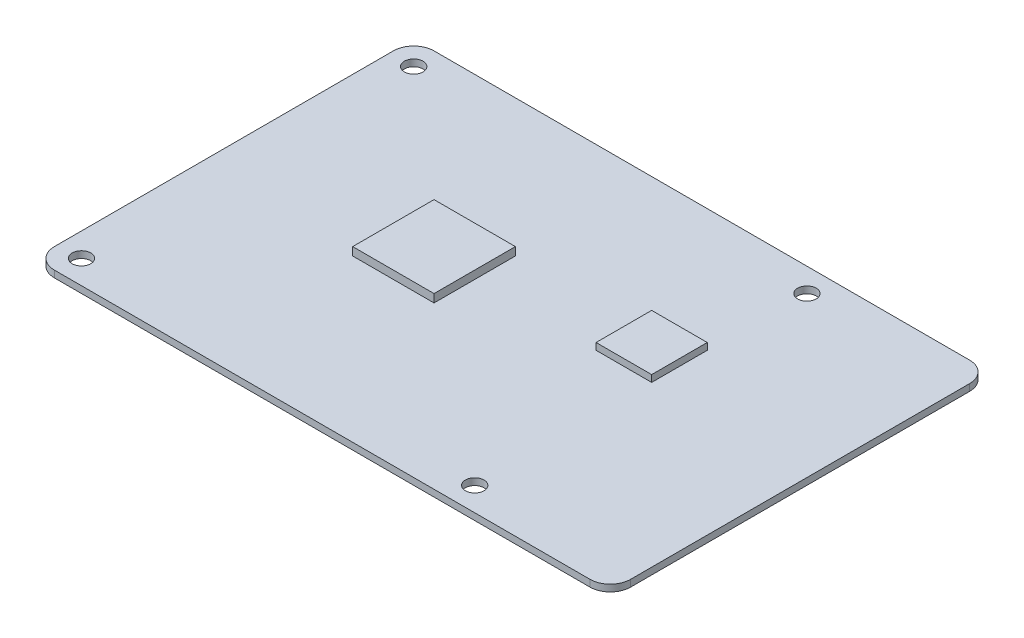
ISO-10303-21;
HEADER;
FILE_DESCRIPTION(('STEP AP214'),'2;1');
FILE_NAME('part.step','',(''),(''),'','','');
FILE_SCHEMA(('AUTOMOTIVE_DESIGN { 1 0 10303 214 1 1 1 1 }'));
ENDSEC;
DATA;
#1=APPLICATION_CONTEXT('core data for automotive mechanical design processes');
#2=APPLICATION_PROTOCOL_DEFINITION('international standard','automotive_design',2000,#1);
#3=PRODUCT_CONTEXT('',#1,'mechanical');
#4=PRODUCT('Part','Part','',(#3));
#5=PRODUCT_RELATED_PRODUCT_CATEGORY('part','',(#4));
#6=PRODUCT_DEFINITION_FORMATION('','',#4);
#7=PRODUCT_DEFINITION_CONTEXT('part definition',#1,'design');
#8=PRODUCT_DEFINITION('design','',#6,#7);
#9=PRODUCT_DEFINITION_SHAPE('','',#8);
#10=(LENGTH_UNIT() NAMED_UNIT(*) SI_UNIT(.MILLI.,.METRE.));
#11=(NAMED_UNIT(*) PLANE_ANGLE_UNIT() SI_UNIT($,.RADIAN.));
#12=(NAMED_UNIT(*) SI_UNIT($,.STERADIAN.) SOLID_ANGLE_UNIT());
#13=UNCERTAINTY_MEASURE_WITH_UNIT(LENGTH_MEASURE(1.E-05),#10,'distance_accuracy_value','');
#14=(GEOMETRIC_REPRESENTATION_CONTEXT(3) GLOBAL_UNCERTAINTY_ASSIGNED_CONTEXT((#13)) GLOBAL_UNIT_ASSIGNED_CONTEXT((#10,
#11,#12)) REPRESENTATION_CONTEXT('',''));
#15=CARTESIAN_POINT('',(0.,0.,0.));
#16=DIRECTION('',(0.,0.,1.));
#17=DIRECTION('',(1.,0.,0.));
#18=AXIS2_PLACEMENT_3D('',#15,#16,#17);
#19=CARTESIAN_POINT('',(0.,1.,0.));
#20=DIRECTION('',(0.,1.,0.));
#21=DIRECTION('',(0.,0.,1.));
#22=AXIS2_PLACEMENT_3D('',#19,#20,#21);
#23=PLANE('',#22);
#24=DIRECTION('',(-1.,0.,0.));
#25=VECTOR('',#24,1.);
#26=CARTESIAN_POINT('',(-19.3,1.,-7.79999999999998));
#27=LINE('',#26,#25);
#28=CARTESIAN_POINT('',(-7.29999999999999,1.,-7.79999999999998));
#29=VERTEX_POINT('',#28);
#30=CARTESIAN_POINT('',(-19.3,1.,-7.79999999999998));
#31=VERTEX_POINT('',#30);
#32=EDGE_CURVE('E177',#29,#31,#27,.T.);
#33=ORIENTED_EDGE('',*,*,#32,.F.);
#34=DIRECTION('',(0.,0.,-1.));
#35=VECTOR('',#34,1.);
#36=CARTESIAN_POINT('',(-7.29999999999999,1.,-7.79999999999998));
#37=LINE('',#36,#35);
#38=CARTESIAN_POINT('',(-7.29999999999999,1.,4.20000000000002));
#39=VERTEX_POINT('',#38);
#40=EDGE_CURVE('E174',#39,#29,#37,.T.);
#41=ORIENTED_EDGE('',*,*,#40,.F.);
#42=DIRECTION('',(1.,0.,0.));
#43=VECTOR('',#42,1.);
#44=CARTESIAN_POINT('',(-19.3,1.,4.20000000000002));
#45=LINE('',#44,#43);
#46=CARTESIAN_POINT('',(-19.3,1.,4.20000000000002));
#47=VERTEX_POINT('',#46);
#48=EDGE_CURVE('E186',#47,#39,#45,.T.);
#49=ORIENTED_EDGE('',*,*,#48,.F.);
#50=DIRECTION('',(0.,0.,1.));
#51=VECTOR('',#50,1.);
#52=CARTESIAN_POINT('',(-19.3,1.,-7.79999999999998));
#53=LINE('',#52,#51);
#54=EDGE_CURVE('E194',#31,#47,#53,.T.);
#55=ORIENTED_EDGE('',*,*,#54,.F.);
#56=EDGE_LOOP('',(#33,#41,#49,#55));
#57=FACE_BOUND('',#56,.T.);
#58=CARTESIAN_POINT('',(19.,1.,24.5));
#59=DIRECTION('',(0.,1.,0.));
#60=DIRECTION('',(0.,0.,1.));
#61=AXIS2_PLACEMENT_3D('',#58,#59,#60);
#62=CIRCLE('',#61,1.375);
#63=CARTESIAN_POINT('',(19.,1.,25.875));
#64=VERTEX_POINT('',#63);
#65=EDGE_CURVE('E205',#64,#64,#62,.T.);
#66=ORIENTED_EDGE('',*,*,#65,.F.);
#67=EDGE_LOOP('',(#66));
#68=FACE_BOUND('',#67,.T.);
#69=CARTESIAN_POINT('',(-39.,1.,24.5));
#70=DIRECTION('',(0.,1.,0.));
#71=DIRECTION('',(0.,0.,1.));
#72=AXIS2_PLACEMENT_3D('',#69,#70,#71);
#73=CIRCLE('',#72,1.375);
#74=CARTESIAN_POINT('',(-39.,1.,25.875));
#75=VERTEX_POINT('',#74);
#76=EDGE_CURVE('E209',#75,#75,#73,.T.);
#77=ORIENTED_EDGE('',*,*,#76,.F.);
#78=EDGE_LOOP('',(#77));
#79=FACE_BOUND('',#78,.T.);
#80=CARTESIAN_POINT('',(-39.,1.,-24.5));
#81=DIRECTION('',(0.,1.,0.));
#82=DIRECTION('',(0.,0.,1.));
#83=AXIS2_PLACEMENT_3D('',#80,#81,#82);
#84=CIRCLE('',#83,1.375);
#85=CARTESIAN_POINT('',(-39.,1.,-23.125));
#86=VERTEX_POINT('',#85);
#87=EDGE_CURVE('E215',#86,#86,#84,.T.);
#88=ORIENTED_EDGE('',*,*,#87,.F.);
#89=EDGE_LOOP('',(#88));
#90=FACE_BOUND('',#89,.T.);
#91=CARTESIAN_POINT('',(19.,1.,-24.5));
#92=DIRECTION('',(0.,1.,0.));
#93=DIRECTION('',(0.,0.,1.));
#94=AXIS2_PLACEMENT_3D('',#91,#92,#93);
#95=CIRCLE('',#94,1.375);
#96=CARTESIAN_POINT('',(19.,1.,-23.125));
#97=VERTEX_POINT('',#96);
#98=EDGE_CURVE('E221',#97,#97,#95,.T.);
#99=ORIENTED_EDGE('',*,*,#98,.F.);
#100=EDGE_LOOP('',(#99));
#101=FACE_BOUND('',#100,.T.);
#102=DIRECTION('',(-1.,0.,0.));
#103=VECTOR('',#102,1.);
#104=CARTESIAN_POINT('',(42.5,1.,-28.));
#105=LINE('',#104,#103);
#106=CARTESIAN_POINT('',(39.5,1.,-28.));
#107=VERTEX_POINT('',#106);
#108=CARTESIAN_POINT('',(-39.5,1.,-28.));
#109=VERTEX_POINT('',#108);
#110=EDGE_CURVE('E240',#107,#109,#105,.T.);
#111=ORIENTED_EDGE('',*,*,#110,.T.);
#112=CARTESIAN_POINT('',(-39.5,1.,-25.));
#113=DIRECTION('',(0.,1.,0.));
#114=DIRECTION('',(0.,0.,1.));
#115=AXIS2_PLACEMENT_3D('',#112,#113,#114);
#116=CIRCLE('',#115,3.);
#117=CARTESIAN_POINT('',(-42.5,1.,-25.));
#118=VERTEX_POINT('',#117);
#119=EDGE_CURVE('E277',#109,#118,#116,.T.);
#120=ORIENTED_EDGE('',*,*,#119,.T.);
#121=DIRECTION('',(0.,0.,1.));
#122=VECTOR('',#121,1.);
#123=CARTESIAN_POINT('',(-42.5,1.,28.));
#124=LINE('',#123,#122);
#125=CARTESIAN_POINT('',(-42.5,1.,25.));
#126=VERTEX_POINT('',#125);
#127=EDGE_CURVE('E230',#118,#126,#124,.T.);
#128=ORIENTED_EDGE('',*,*,#127,.T.);
#129=CARTESIAN_POINT('',(-39.5,1.,25.));
#130=DIRECTION('',(0.,1.,0.));
#131=DIRECTION('',(0.,0.,1.));
#132=AXIS2_PLACEMENT_3D('',#129,#130,#131);
#133=CIRCLE('',#132,3.);
#134=CARTESIAN_POINT('',(-39.5,1.,28.));
#135=VERTEX_POINT('',#134);
#136=EDGE_CURVE('E271',#126,#135,#133,.T.);
#137=ORIENTED_EDGE('',*,*,#136,.T.);
#138=DIRECTION('',(1.,0.,0.));
#139=VECTOR('',#138,1.);
#140=CARTESIAN_POINT('',(42.5,1.,28.));
#141=LINE('',#140,#139);
#142=CARTESIAN_POINT('',(39.5,1.,28.));
#143=VERTEX_POINT('',#142);
#144=EDGE_CURVE('E233',#135,#143,#141,.T.);
#145=ORIENTED_EDGE('',*,*,#144,.T.);
#146=CARTESIAN_POINT('',(39.5,1.,25.));
#147=DIRECTION('',(0.,1.,0.));
#148=DIRECTION('',(0.,0.,1.));
#149=AXIS2_PLACEMENT_3D('',#146,#147,#148);
#150=CIRCLE('',#149,3.);
#151=CARTESIAN_POINT('',(42.5,1.,25.));
#152=VERTEX_POINT('',#151);
#153=EDGE_CURVE('E273',#143,#152,#150,.T.);
#154=ORIENTED_EDGE('',*,*,#153,.T.);
#155=DIRECTION('',(0.,0.,-1.));
#156=VECTOR('',#155,1.);
#157=CARTESIAN_POINT('',(42.5,1.,28.));
#158=LINE('',#157,#156);
#159=CARTESIAN_POINT('',(42.5,1.,-25.));
#160=VERTEX_POINT('',#159);
#161=EDGE_CURVE('E237',#152,#160,#158,.T.);
#162=ORIENTED_EDGE('',*,*,#161,.T.);
#163=CARTESIAN_POINT('',(39.5,1.,-25.));
#164=DIRECTION('',(0.,1.,0.));
#165=DIRECTION('',(0.,0.,1.));
#166=AXIS2_PLACEMENT_3D('',#163,#164,#165);
#167=CIRCLE('',#166,3.);
#168=EDGE_CURVE('E275',#160,#107,#167,.T.);
#169=ORIENTED_EDGE('',*,*,#168,.T.);
#170=EDGE_LOOP('',(#111,#120,#128,#137,#145,#154,#162,#169));
#171=FACE_BOUND('',#170,.T.);
#172=DIRECTION('',(-1.,0.,0.));
#173=VECTOR('',#172,1.);
#174=CARTESIAN_POINT('',(10.7,1.,-9.9));
#175=LINE('',#174,#173);
#176=CARTESIAN_POINT('',(18.9,1.,-9.9));
#177=VERTEX_POINT('',#176);
#178=CARTESIAN_POINT('',(10.7,1.,-9.9));
#179=VERTEX_POINT('',#178);
#180=EDGE_CURVE('E517',#177,#179,#175,.T.);
#181=ORIENTED_EDGE('',*,*,#180,.F.);
#182=DIRECTION('',(0.,0.,-1.));
#183=VECTOR('',#182,1.);
#184=CARTESIAN_POINT('',(18.9,1.,-9.9));
#185=LINE('',#184,#183);
#186=CARTESIAN_POINT('',(18.9,1.,-1.7));
#187=VERTEX_POINT('',#186);
#188=EDGE_CURVE('E172',#187,#177,#185,.T.);
#189=ORIENTED_EDGE('',*,*,#188,.F.);
#190=DIRECTION('',(1.,0.,0.));
#191=VECTOR('',#190,1.);
#192=CARTESIAN_POINT('',(10.7,1.,-1.7));
#193=LINE('',#192,#191);
#194=CARTESIAN_POINT('',(10.7,1.,-1.7));
#195=VERTEX_POINT('',#194);
#196=EDGE_CURVE('E168',#195,#187,#193,.T.);
#197=ORIENTED_EDGE('',*,*,#196,.F.);
#198=DIRECTION('',(0.,0.,1.));
#199=VECTOR('',#198,1.);
#200=CARTESIAN_POINT('',(10.7,1.,-9.9));
#201=LINE('',#200,#199);
#202=EDGE_CURVE('E514',#179,#195,#201,.T.);
#203=ORIENTED_EDGE('',*,*,#202,.F.);
#204=EDGE_LOOP('',(#181,#189,#197,#203));
#205=FACE_BOUND('',#204,.T.);
#206=ADVANCED_FACE('F36',(#57,#68,#79,#90,#101,#171,#205),#23,.T.);
#207=CARTESIAN_POINT('',(-42.5,1.,28.));
#208=DIRECTION('',(1.,0.,0.));
#209=DIRECTION('',(0.,0.,-1.));
#210=AXIS2_PLACEMENT_3D('',#207,#208,#209);
#211=PLANE('',#210);
#212=ORIENTED_EDGE('',*,*,#127,.F.);
#213=DIRECTION('',(0.,-1.,0.));
#214=VECTOR('',#213,1.);
#215=CARTESIAN_POINT('',(-42.5,1.,-25.));
#216=LINE('',#215,#214);
#217=CARTESIAN_POINT('',(-42.5,0.,-25.));
#218=VERTEX_POINT('',#217);
#219=EDGE_CURVE('E255',#118,#218,#216,.T.);
#220=ORIENTED_EDGE('',*,*,#219,.T.);
#221=DIRECTION('',(0.,0.,1.));
#222=VECTOR('',#221,1.);
#223=CARTESIAN_POINT('',(-42.5,0.,28.));
#224=LINE('',#223,#222);
#225=CARTESIAN_POINT('',(-42.5,0.,25.));
#226=VERTEX_POINT('',#225);
#227=EDGE_CURVE('E227',#218,#226,#224,.T.);
#228=ORIENTED_EDGE('',*,*,#227,.T.);
#229=DIRECTION('',(0.,-1.,0.));
#230=VECTOR('',#229,1.);
#231=CARTESIAN_POINT('',(-42.5,1.,25.));
#232=LINE('',#231,#230);
#233=EDGE_CURVE('E243',#226,#126,#232,.F.);
#234=ORIENTED_EDGE('',*,*,#233,.T.);
#235=EDGE_LOOP('',(#212,#220,#228,#234));
#236=FACE_BOUND('',#235,.T.);
#237=ADVANCED_FACE('F321',(#236),#211,.F.);
#238=CARTESIAN_POINT('',(42.5,1.,28.));
#239=DIRECTION('',(0.,0.,-1.));
#240=DIRECTION('',(-1.,0.,0.));
#241=AXIS2_PLACEMENT_3D('',#238,#239,#240);
#242=PLANE('',#241);
#243=DIRECTION('',(1.,0.,0.));
#244=VECTOR('',#243,1.);
#245=CARTESIAN_POINT('',(42.5,0.,28.));
#246=LINE('',#245,#244);
#247=CARTESIAN_POINT('',(-39.5,0.,28.));
#248=VERTEX_POINT('',#247);
#249=CARTESIAN_POINT('',(39.5,0.,28.));
#250=VERTEX_POINT('',#249);
#251=EDGE_CURVE('E246',#248,#250,#246,.T.);
#252=ORIENTED_EDGE('',*,*,#251,.T.);
#253=DIRECTION('',(0.,-1.,0.));
#254=VECTOR('',#253,1.);
#255=CARTESIAN_POINT('',(39.5,1.,28.));
#256=LINE('',#255,#254);
#257=EDGE_CURVE('E11',#250,#143,#256,.F.);
#258=ORIENTED_EDGE('',*,*,#257,.T.);
#259=ORIENTED_EDGE('',*,*,#144,.F.);
#260=DIRECTION('',(0.,-1.,0.));
#261=VECTOR('',#260,1.);
#262=CARTESIAN_POINT('',(-39.5,1.,28.));
#263=LINE('',#262,#261);
#264=EDGE_CURVE('E44',#135,#248,#263,.T.);
#265=ORIENTED_EDGE('',*,*,#264,.T.);
#266=EDGE_LOOP('',(#252,#258,#259,#265));
#267=FACE_BOUND('',#266,.T.);
#268=ADVANCED_FACE('F288',(#267),#242,.F.);
#269=CARTESIAN_POINT('',(42.5,1.,28.));
#270=DIRECTION('',(-1.,0.,0.));
#271=DIRECTION('',(0.,0.,1.));
#272=AXIS2_PLACEMENT_3D('',#269,#270,#271);
#273=PLANE('',#272);
#274=DIRECTION('',(0.,0.,-1.));
#275=VECTOR('',#274,1.);
#276=CARTESIAN_POINT('',(42.5,0.,28.));
#277=LINE('',#276,#275);
#278=CARTESIAN_POINT('',(42.5,0.,25.));
#279=VERTEX_POINT('',#278);
#280=CARTESIAN_POINT('',(42.5,0.,-25.));
#281=VERTEX_POINT('',#280);
#282=EDGE_CURVE('E249',#279,#281,#277,.T.);
#283=ORIENTED_EDGE('',*,*,#282,.T.);
#284=DIRECTION('',(0.,-1.,0.));
#285=VECTOR('',#284,1.);
#286=CARTESIAN_POINT('',(42.5,1.,-25.));
#287=LINE('',#286,#285);
#288=EDGE_CURVE('E282',#281,#160,#287,.F.);
#289=ORIENTED_EDGE('',*,*,#288,.T.);
#290=ORIENTED_EDGE('',*,*,#161,.F.);
#291=DIRECTION('',(0.,-1.,0.));
#292=VECTOR('',#291,1.);
#293=CARTESIAN_POINT('',(42.5,1.,25.));
#294=LINE('',#293,#292);
#295=EDGE_CURVE('E279',#152,#279,#294,.T.);
#296=ORIENTED_EDGE('',*,*,#295,.T.);
#297=EDGE_LOOP('',(#283,#289,#290,#296));
#298=FACE_BOUND('',#297,.T.);
#299=ADVANCED_FACE('F302',(#298),#273,.F.);
#300=CARTESIAN_POINT('',(42.5,1.,-28.));
#301=DIRECTION('',(0.,0.,1.));
#302=DIRECTION('',(1.,0.,0.));
#303=AXIS2_PLACEMENT_3D('',#300,#301,#302);
#304=PLANE('',#303);
#305=DIRECTION('',(-1.,0.,0.));
#306=VECTOR('',#305,1.);
#307=CARTESIAN_POINT('',(42.5,0.,-28.));
#308=LINE('',#307,#306);
#309=CARTESIAN_POINT('',(39.5,0.,-28.));
#310=VERTEX_POINT('',#309);
#311=CARTESIAN_POINT('',(-39.5,0.,-28.));
#312=VERTEX_POINT('',#311);
#313=EDGE_CURVE('E234',#310,#312,#308,.T.);
#314=ORIENTED_EDGE('',*,*,#313,.T.);
#315=DIRECTION('',(0.,-1.,0.));
#316=VECTOR('',#315,1.);
#317=CARTESIAN_POINT('',(-39.5,1.,-28.));
#318=LINE('',#317,#316);
#319=EDGE_CURVE('E269',#312,#109,#318,.F.);
#320=ORIENTED_EDGE('',*,*,#319,.T.);
#321=ORIENTED_EDGE('',*,*,#110,.F.);
#322=DIRECTION('',(0.,-1.,0.));
#323=VECTOR('',#322,1.);
#324=CARTESIAN_POINT('',(39.5,1.,-28.));
#325=LINE('',#324,#323);
#326=EDGE_CURVE('E266',#107,#310,#325,.T.);
#327=ORIENTED_EDGE('',*,*,#326,.T.);
#328=EDGE_LOOP('',(#314,#320,#321,#327));
#329=FACE_BOUND('',#328,.T.);
#330=ADVANCED_FACE('F313',(#329),#304,.F.);
#331=CARTESIAN_POINT('',(0.,0.,0.));
#332=DIRECTION('',(0.,1.,0.));
#333=DIRECTION('',(0.,0.,1.));
#334=AXIS2_PLACEMENT_3D('',#331,#332,#333);
#335=PLANE('',#334);
#336=CARTESIAN_POINT('',(19.,0.,24.5));
#337=DIRECTION('',(0.,1.,0.));
#338=DIRECTION('',(0.,0.,1.));
#339=AXIS2_PLACEMENT_3D('',#336,#337,#338);
#340=CIRCLE('',#339,1.375);
#341=CARTESIAN_POINT('',(19.,0.,25.875));
#342=VERTEX_POINT('',#341);
#343=EDGE_CURVE('E206',#342,#342,#340,.T.);
#344=ORIENTED_EDGE('',*,*,#343,.T.);
#345=EDGE_LOOP('',(#344));
#346=FACE_BOUND('',#345,.T.);
#347=CARTESIAN_POINT('',(-39.,0.,24.5));
#348=DIRECTION('',(0.,1.,0.));
#349=DIRECTION('',(0.,0.,1.));
#350=AXIS2_PLACEMENT_3D('',#347,#348,#349);
#351=CIRCLE('',#350,1.375);
#352=CARTESIAN_POINT('',(-39.,0.,25.875));
#353=VERTEX_POINT('',#352);
#354=EDGE_CURVE('E212',#353,#353,#351,.T.);
#355=ORIENTED_EDGE('',*,*,#354,.T.);
#356=EDGE_LOOP('',(#355));
#357=FACE_BOUND('',#356,.T.);
#358=CARTESIAN_POINT('',(-39.,0.,-24.5));
#359=DIRECTION('',(0.,1.,0.));
#360=DIRECTION('',(0.,0.,1.));
#361=AXIS2_PLACEMENT_3D('',#358,#359,#360);
#362=CIRCLE('',#361,1.375);
#363=CARTESIAN_POINT('',(-39.,0.,-23.125));
#364=VERTEX_POINT('',#363);
#365=EDGE_CURVE('E218',#364,#364,#362,.T.);
#366=ORIENTED_EDGE('',*,*,#365,.T.);
#367=EDGE_LOOP('',(#366));
#368=FACE_BOUND('',#367,.T.);
#369=CARTESIAN_POINT('',(19.,0.,-24.5));
#370=DIRECTION('',(0.,1.,0.));
#371=DIRECTION('',(0.,0.,1.));
#372=AXIS2_PLACEMENT_3D('',#369,#370,#371);
#373=CIRCLE('',#372,1.375);
#374=CARTESIAN_POINT('',(19.,0.,-23.125));
#375=VERTEX_POINT('',#374);
#376=EDGE_CURVE('E224',#375,#375,#373,.T.);
#377=ORIENTED_EDGE('',*,*,#376,.T.);
#378=EDGE_LOOP('',(#377));
#379=FACE_BOUND('',#378,.T.);
#380=ORIENTED_EDGE('',*,*,#227,.F.);
#381=CARTESIAN_POINT('',(-39.5,0.,-25.));
#382=DIRECTION('',(0.,1.,0.));
#383=DIRECTION('',(0.,0.,1.));
#384=AXIS2_PLACEMENT_3D('',#381,#382,#383);
#385=CIRCLE('',#384,3.);
#386=EDGE_CURVE('E264',#218,#312,#385,.F.);
#387=ORIENTED_EDGE('',*,*,#386,.T.);
#388=ORIENTED_EDGE('',*,*,#313,.F.);
#389=CARTESIAN_POINT('',(39.5,0.,-25.));
#390=DIRECTION('',(0.,1.,0.));
#391=DIRECTION('',(0.,0.,1.));
#392=AXIS2_PLACEMENT_3D('',#389,#390,#391);
#393=CIRCLE('',#392,3.);
#394=EDGE_CURVE('E262',#310,#281,#393,.F.);
#395=ORIENTED_EDGE('',*,*,#394,.T.);
#396=ORIENTED_EDGE('',*,*,#282,.F.);
#397=CARTESIAN_POINT('',(39.5,0.,25.));
#398=DIRECTION('',(0.,1.,0.));
#399=DIRECTION('',(0.,0.,1.));
#400=AXIS2_PLACEMENT_3D('',#397,#398,#399);
#401=CIRCLE('',#400,3.);
#402=EDGE_CURVE('E260',#279,#250,#401,.F.);
#403=ORIENTED_EDGE('',*,*,#402,.T.);
#404=ORIENTED_EDGE('',*,*,#251,.F.);
#405=CARTESIAN_POINT('',(-39.5,0.,25.));
#406=DIRECTION('',(0.,1.,0.));
#407=DIRECTION('',(0.,0.,1.));
#408=AXIS2_PLACEMENT_3D('',#405,#406,#407);
#409=CIRCLE('',#408,3.);
#410=EDGE_CURVE('E258',#248,#226,#409,.F.);
#411=ORIENTED_EDGE('',*,*,#410,.T.);
#412=EDGE_LOOP('',(#380,#387,#388,#395,#396,#403,#404,#411));
#413=FACE_BOUND('',#412,.T.);
#414=ADVANCED_FACE('F294',(#346,#357,#368,#379,#413),#335,.F.);
#415=CARTESIAN_POINT('',(-39.5,1.,-25.));
#416=DIRECTION('',(0.,-1.,0.));
#417=DIRECTION('',(0.,0.,-1.));
#418=AXIS2_PLACEMENT_3D('',#415,#416,#417);
#419=CYLINDRICAL_SURFACE('',#418,3.);
#420=ORIENTED_EDGE('',*,*,#119,.F.);
#421=ORIENTED_EDGE('',*,*,#319,.F.);
#422=ORIENTED_EDGE('',*,*,#386,.F.);
#423=ORIENTED_EDGE('',*,*,#219,.F.);
#424=EDGE_LOOP('',(#420,#421,#422,#423));
#425=FACE_BOUND('',#424,.T.);
#426=ADVANCED_FACE('F318',(#425),#419,.T.);
#427=CARTESIAN_POINT('',(39.5,1.,-25.));
#428=DIRECTION('',(0.,-1.,0.));
#429=DIRECTION('',(0.,0.,-1.));
#430=AXIS2_PLACEMENT_3D('',#427,#428,#429);
#431=CYLINDRICAL_SURFACE('',#430,3.);
#432=ORIENTED_EDGE('',*,*,#168,.F.);
#433=ORIENTED_EDGE('',*,*,#288,.F.);
#434=ORIENTED_EDGE('',*,*,#394,.F.);
#435=ORIENTED_EDGE('',*,*,#326,.F.);
#436=EDGE_LOOP('',(#432,#433,#434,#435));
#437=FACE_BOUND('',#436,.T.);
#438=ADVANCED_FACE('F310',(#437),#431,.T.);
#439=CARTESIAN_POINT('',(39.5,1.,25.));
#440=DIRECTION('',(0.,-1.,0.));
#441=DIRECTION('',(0.,0.,-1.));
#442=AXIS2_PLACEMENT_3D('',#439,#440,#441);
#443=CYLINDRICAL_SURFACE('',#442,3.);
#444=ORIENTED_EDGE('',*,*,#153,.F.);
#445=ORIENTED_EDGE('',*,*,#257,.F.);
#446=ORIENTED_EDGE('',*,*,#402,.F.);
#447=ORIENTED_EDGE('',*,*,#295,.F.);
#448=EDGE_LOOP('',(#444,#445,#446,#447));
#449=FACE_BOUND('',#448,.T.);
#450=ADVANCED_FACE('F299',(#449),#443,.T.);
#451=CARTESIAN_POINT('',(-39.5,1.,25.));
#452=DIRECTION('',(0.,-1.,0.));
#453=DIRECTION('',(0.,0.,-1.));
#454=AXIS2_PLACEMENT_3D('',#451,#452,#453);
#455=CYLINDRICAL_SURFACE('',#454,3.);
#456=ORIENTED_EDGE('',*,*,#136,.F.);
#457=ORIENTED_EDGE('',*,*,#233,.F.);
#458=ORIENTED_EDGE('',*,*,#410,.F.);
#459=ORIENTED_EDGE('',*,*,#264,.F.);
#460=EDGE_LOOP('',(#456,#457,#458,#459));
#461=FACE_BOUND('',#460,.T.);
#462=ADVANCED_FACE('F38',(#461),#455,.T.);
#463=CARTESIAN_POINT('',(19.,0.,-24.5));
#464=DIRECTION('',(0.,1.,0.));
#465=DIRECTION('',(0.,0.,1.));
#466=AXIS2_PLACEMENT_3D('',#463,#464,#465);
#467=CYLINDRICAL_SURFACE('',#466,1.375);
#468=ORIENTED_EDGE('',*,*,#376,.F.);
#469=EDGE_LOOP('',(#468));
#470=FACE_BOUND('',#469,.T.);
#471=ORIENTED_EDGE('',*,*,#98,.T.);
#472=EDGE_LOOP('',(#471));
#473=FACE_BOUND('',#472,.T.);
#474=ADVANCED_FACE('F324',(#470,#473),#467,.F.);
#475=CARTESIAN_POINT('',(-39.,0.,-24.5));
#476=DIRECTION('',(0.,1.,0.));
#477=DIRECTION('',(0.,0.,1.));
#478=AXIS2_PLACEMENT_3D('',#475,#476,#477);
#479=CYLINDRICAL_SURFACE('',#478,1.375);
#480=ORIENTED_EDGE('',*,*,#365,.F.);
#481=EDGE_LOOP('',(#480));
#482=FACE_BOUND('',#481,.T.);
#483=ORIENTED_EDGE('',*,*,#87,.T.);
#484=EDGE_LOOP('',(#483));
#485=FACE_BOUND('',#484,.T.);
#486=ADVANCED_FACE('F329',(#482,#485),#479,.F.);
#487=CARTESIAN_POINT('',(-39.,0.,24.5));
#488=DIRECTION('',(0.,1.,0.));
#489=DIRECTION('',(0.,0.,1.));
#490=AXIS2_PLACEMENT_3D('',#487,#488,#489);
#491=CYLINDRICAL_SURFACE('',#490,1.375);
#492=ORIENTED_EDGE('',*,*,#354,.F.);
#493=EDGE_LOOP('',(#492));
#494=FACE_BOUND('',#493,.T.);
#495=ORIENTED_EDGE('',*,*,#76,.T.);
#496=EDGE_LOOP('',(#495));
#497=FACE_BOUND('',#496,.T.);
#498=ADVANCED_FACE('F390',(#494,#497),#491,.F.);
#499=CARTESIAN_POINT('',(19.,0.,24.5));
#500=DIRECTION('',(0.,1.,0.));
#501=DIRECTION('',(0.,0.,1.));
#502=AXIS2_PLACEMENT_3D('',#499,#500,#501);
#503=CYLINDRICAL_SURFACE('',#502,1.375);
#504=ORIENTED_EDGE('',*,*,#343,.F.);
#505=EDGE_LOOP('',(#504));
#506=FACE_BOUND('',#505,.T.);
#507=ORIENTED_EDGE('',*,*,#65,.T.);
#508=EDGE_LOOP('',(#507));
#509=FACE_BOUND('',#508,.T.);
#510=ADVANCED_FACE('F399',(#506,#509),#503,.F.);
#511=CARTESIAN_POINT('',(-7.29999999999999,2.2,-7.79999999999998));
#512=DIRECTION('',(-1.,0.,0.));
#513=DIRECTION('',(0.,0.,1.));
#514=AXIS2_PLACEMENT_3D('',#511,#512,#513);
#515=PLANE('',#514);
#516=ORIENTED_EDGE('',*,*,#40,.T.);
#517=DIRECTION('',(0.,-1.,0.));
#518=VECTOR('',#517,1.);
#519=CARTESIAN_POINT('',(-7.29999999999999,2.2,-7.79999999999998));
#520=LINE('',#519,#518);
#521=CARTESIAN_POINT('',(-7.29999999999999,2.2,-7.79999999999998));
#522=VERTEX_POINT('',#521);
#523=EDGE_CURVE('E203',#522,#29,#520,.T.);
#524=ORIENTED_EDGE('',*,*,#523,.F.);
#525=DIRECTION('',(0.,0.,-1.));
#526=VECTOR('',#525,1.);
#527=CARTESIAN_POINT('',(-7.29999999999999,2.2,-7.79999999999998));
#528=LINE('',#527,#526);
#529=CARTESIAN_POINT('',(-7.29999999999999,2.2,4.20000000000002));
#530=VERTEX_POINT('',#529);
#531=EDGE_CURVE('E182',#530,#522,#528,.T.);
#532=ORIENTED_EDGE('',*,*,#531,.F.);
#533=DIRECTION('',(0.,-1.,0.));
#534=VECTOR('',#533,1.);
#535=CARTESIAN_POINT('',(-7.29999999999999,2.2,4.20000000000002));
#536=LINE('',#535,#534);
#537=EDGE_CURVE('E191',#530,#39,#536,.T.);
#538=ORIENTED_EDGE('',*,*,#537,.T.);
#539=EDGE_LOOP('',(#516,#524,#532,#538));
#540=FACE_BOUND('',#539,.T.);
#541=ADVANCED_FACE('F409',(#540),#515,.F.);
#542=CARTESIAN_POINT('',(-19.3,2.2,-7.79999999999998));
#543=DIRECTION('',(0.,0.,1.));
#544=DIRECTION('',(1.,0.,0.));
#545=AXIS2_PLACEMENT_3D('',#542,#543,#544);
#546=PLANE('',#545);
#547=ORIENTED_EDGE('',*,*,#32,.T.);
#548=DIRECTION('',(0.,-1.,0.));
#549=VECTOR('',#548,1.);
#550=CARTESIAN_POINT('',(-19.3,2.2,-7.79999999999998));
#551=LINE('',#550,#549);
#552=CARTESIAN_POINT('',(-19.3,2.2,-7.79999999999998));
#553=VERTEX_POINT('',#552);
#554=EDGE_CURVE('E200',#553,#31,#551,.T.);
#555=ORIENTED_EDGE('',*,*,#554,.F.);
#556=DIRECTION('',(-1.,0.,0.));
#557=VECTOR('',#556,1.);
#558=CARTESIAN_POINT('',(-19.3,2.2,-7.79999999999998));
#559=LINE('',#558,#557);
#560=EDGE_CURVE('E185',#522,#553,#559,.T.);
#561=ORIENTED_EDGE('',*,*,#560,.F.);
#562=ORIENTED_EDGE('',*,*,#523,.T.);
#563=EDGE_LOOP('',(#547,#555,#561,#562));
#564=FACE_BOUND('',#563,.T.);
#565=ADVANCED_FACE('F419',(#564),#546,.F.);
#566=CARTESIAN_POINT('',(-19.3,2.2,-7.79999999999998));
#567=DIRECTION('',(1.,0.,0.));
#568=DIRECTION('',(0.,0.,-1.));
#569=AXIS2_PLACEMENT_3D('',#566,#567,#568);
#570=PLANE('',#569);
#571=ORIENTED_EDGE('',*,*,#54,.T.);
#572=DIRECTION('',(0.,-1.,0.));
#573=VECTOR('',#572,1.);
#574=CARTESIAN_POINT('',(-19.3,2.2,4.20000000000002));
#575=LINE('',#574,#573);
#576=CARTESIAN_POINT('',(-19.3,2.2,4.20000000000002));
#577=VERTEX_POINT('',#576);
#578=EDGE_CURVE('E59',#577,#47,#575,.T.);
#579=ORIENTED_EDGE('',*,*,#578,.F.);
#580=DIRECTION('',(0.,0.,1.));
#581=VECTOR('',#580,1.);
#582=CARTESIAN_POINT('',(-19.3,2.2,-7.79999999999998));
#583=LINE('',#582,#581);
#584=EDGE_CURVE('E188',#553,#577,#583,.T.);
#585=ORIENTED_EDGE('',*,*,#584,.F.);
#586=ORIENTED_EDGE('',*,*,#554,.T.);
#587=EDGE_LOOP('',(#571,#579,#585,#586));
#588=FACE_BOUND('',#587,.T.);
#589=ADVANCED_FACE('F429',(#588),#570,.F.);
#590=CARTESIAN_POINT('',(-19.3,2.2,4.20000000000002));
#591=DIRECTION('',(0.,0.,-1.));
#592=DIRECTION('',(-1.,0.,0.));
#593=AXIS2_PLACEMENT_3D('',#590,#591,#592);
#594=PLANE('',#593);
#595=ORIENTED_EDGE('',*,*,#48,.T.);
#596=ORIENTED_EDGE('',*,*,#537,.F.);
#597=DIRECTION('',(1.,0.,0.));
#598=VECTOR('',#597,1.);
#599=CARTESIAN_POINT('',(-19.3,2.2,4.20000000000002));
#600=LINE('',#599,#598);
#601=EDGE_CURVE('E190',#577,#530,#600,.T.);
#602=ORIENTED_EDGE('',*,*,#601,.F.);
#603=ORIENTED_EDGE('',*,*,#578,.T.);
#604=EDGE_LOOP('',(#595,#596,#602,#603));
#605=FACE_BOUND('',#604,.T.);
#606=ADVANCED_FACE('F439',(#605),#594,.F.);
#607=CARTESIAN_POINT('',(0.,2.2,0.));
#608=DIRECTION('',(0.,1.,0.));
#609=DIRECTION('',(0.,0.,1.));
#610=AXIS2_PLACEMENT_3D('',#607,#608,#609);
#611=PLANE('',#610);
#612=ORIENTED_EDGE('',*,*,#531,.T.);
#613=ORIENTED_EDGE('',*,*,#560,.T.);
#614=ORIENTED_EDGE('',*,*,#584,.T.);
#615=ORIENTED_EDGE('',*,*,#601,.T.);
#616=EDGE_LOOP('',(#612,#613,#614,#615));
#617=FACE_BOUND('',#616,.T.);
#618=ADVANCED_FACE('F449',(#617),#611,.T.);
#619=CARTESIAN_POINT('',(18.9,2.,-9.9));
#620=DIRECTION('',(-1.,0.,0.));
#621=DIRECTION('',(0.,0.,1.));
#622=AXIS2_PLACEMENT_3D('',#619,#620,#621);
#623=PLANE('',#622);
#624=ORIENTED_EDGE('',*,*,#188,.T.);
#625=DIRECTION('',(0.,-1.,0.));
#626=VECTOR('',#625,1.);
#627=CARTESIAN_POINT('',(18.9,2.,-9.9));
#628=LINE('',#627,#626);
#629=CARTESIAN_POINT('',(18.9,2.,-9.9));
#630=VERTEX_POINT('',#629);
#631=EDGE_CURVE('E153',#630,#177,#628,.T.);
#632=ORIENTED_EDGE('',*,*,#631,.F.);
#633=DIRECTION('',(0.,0.,-1.));
#634=VECTOR('',#633,1.);
#635=CARTESIAN_POINT('',(18.9,2.,-9.9));
#636=LINE('',#635,#634);
#637=CARTESIAN_POINT('',(18.9,2.,-1.7));
#638=VERTEX_POINT('',#637);
#639=EDGE_CURVE('E160',#638,#630,#636,.T.);
#640=ORIENTED_EDGE('',*,*,#639,.F.);
#641=DIRECTION('',(0.,-1.,0.));
#642=VECTOR('',#641,1.);
#643=CARTESIAN_POINT('',(18.9,2.,-1.7));
#644=LINE('',#643,#642);
#645=EDGE_CURVE('E512',#638,#187,#644,.T.);
#646=ORIENTED_EDGE('',*,*,#645,.T.);
#647=EDGE_LOOP('',(#624,#632,#640,#646));
#648=FACE_BOUND('',#647,.T.);
#649=ADVANCED_FACE('F170',(#648),#623,.F.);
#650=CARTESIAN_POINT('',(10.7,2.,-9.9));
#651=DIRECTION('',(0.,0.,1.));
#652=DIRECTION('',(1.,0.,0.));
#653=AXIS2_PLACEMENT_3D('',#650,#651,#652);
#654=PLANE('',#653);
#655=ORIENTED_EDGE('',*,*,#180,.T.);
#656=DIRECTION('',(0.,-1.,0.));
#657=VECTOR('',#656,1.);
#658=CARTESIAN_POINT('',(10.7,2.,-9.9));
#659=LINE('',#658,#657);
#660=CARTESIAN_POINT('',(10.7,2.,-9.9));
#661=VERTEX_POINT('',#660);
#662=EDGE_CURVE('E156',#661,#179,#659,.T.);
#663=ORIENTED_EDGE('',*,*,#662,.F.);
#664=DIRECTION('',(-1.,0.,0.));
#665=VECTOR('',#664,1.);
#666=CARTESIAN_POINT('',(10.7,2.,-9.9));
#667=LINE('',#666,#665);
#668=EDGE_CURVE('E149',#630,#661,#667,.T.);
#669=ORIENTED_EDGE('',*,*,#668,.F.);
#670=ORIENTED_EDGE('',*,*,#631,.T.);
#671=EDGE_LOOP('',(#655,#663,#669,#670));
#672=FACE_BOUND('',#671,.T.);
#673=ADVANCED_FACE('F151',(#672),#654,.F.);
#674=CARTESIAN_POINT('',(10.7,2.,-9.9));
#675=DIRECTION('',(1.,0.,0.));
#676=DIRECTION('',(0.,0.,-1.));
#677=AXIS2_PLACEMENT_3D('',#674,#675,#676);
#678=PLANE('',#677);
#679=ORIENTED_EDGE('',*,*,#202,.T.);
#680=DIRECTION('',(0.,-1.,0.));
#681=VECTOR('',#680,1.);
#682=CARTESIAN_POINT('',(10.7,2.,-1.7));
#683=LINE('',#682,#681);
#684=CARTESIAN_POINT('',(10.7,2.,-1.7));
#685=VERTEX_POINT('',#684);
#686=EDGE_CURVE('E51',#685,#195,#683,.T.);
#687=ORIENTED_EDGE('',*,*,#686,.F.);
#688=DIRECTION('',(0.,0.,1.));
#689=VECTOR('',#688,1.);
#690=CARTESIAN_POINT('',(10.7,2.,-9.9));
#691=LINE('',#690,#689);
#692=EDGE_CURVE('E159',#661,#685,#691,.T.);
#693=ORIENTED_EDGE('',*,*,#692,.F.);
#694=ORIENTED_EDGE('',*,*,#662,.T.);
#695=EDGE_LOOP('',(#679,#687,#693,#694));
#696=FACE_BOUND('',#695,.T.);
#697=ADVANCED_FACE('F481',(#696),#678,.F.);
#698=CARTESIAN_POINT('',(10.7,2.,-1.7));
#699=DIRECTION('',(0.,0.,-1.));
#700=DIRECTION('',(-1.,0.,0.));
#701=AXIS2_PLACEMENT_3D('',#698,#699,#700);
#702=PLANE('',#701);
#703=ORIENTED_EDGE('',*,*,#196,.T.);
#704=ORIENTED_EDGE('',*,*,#645,.F.);
#705=DIRECTION('',(1.,0.,0.));
#706=VECTOR('',#705,1.);
#707=CARTESIAN_POINT('',(10.7,2.,-1.7));
#708=LINE('',#707,#706);
#709=EDGE_CURVE('E164',#685,#638,#708,.T.);
#710=ORIENTED_EDGE('',*,*,#709,.F.);
#711=ORIENTED_EDGE('',*,*,#686,.T.);
#712=EDGE_LOOP('',(#703,#704,#710,#711));
#713=FACE_BOUND('',#712,.T.);
#714=ADVANCED_FACE('F490',(#713),#702,.F.);
#715=CARTESIAN_POINT('',(0.,2.,0.));
#716=DIRECTION('',(0.,1.,0.));
#717=DIRECTION('',(0.,0.,1.));
#718=AXIS2_PLACEMENT_3D('',#715,#716,#717);
#719=PLANE('',#718);
#720=ORIENTED_EDGE('',*,*,#639,.T.);
#721=ORIENTED_EDGE('',*,*,#668,.T.);
#722=ORIENTED_EDGE('',*,*,#692,.T.);
#723=ORIENTED_EDGE('',*,*,#709,.T.);
#724=EDGE_LOOP('',(#720,#721,#722,#723));
#725=FACE_BOUND('',#724,.T.);
#726=ADVANCED_FACE('F163',(#725),#719,.T.);
#727=CLOSED_SHELL('',(#206,#237,#268,#299,#330,#414,#426,#438,#450,#462,#474,#486,#498,#510,
#541,#565,#589,#606,#618,#649,#673,#697,#714,#726));
#728=MANIFOLD_SOLID_BREP('B2',#727);
#729=ADVANCED_BREP_SHAPE_REPRESENTATION('',(#18,#728),#14);
#730=SHAPE_DEFINITION_REPRESENTATION(#9,#729);
ENDSEC;
END-ISO-10303-21;
